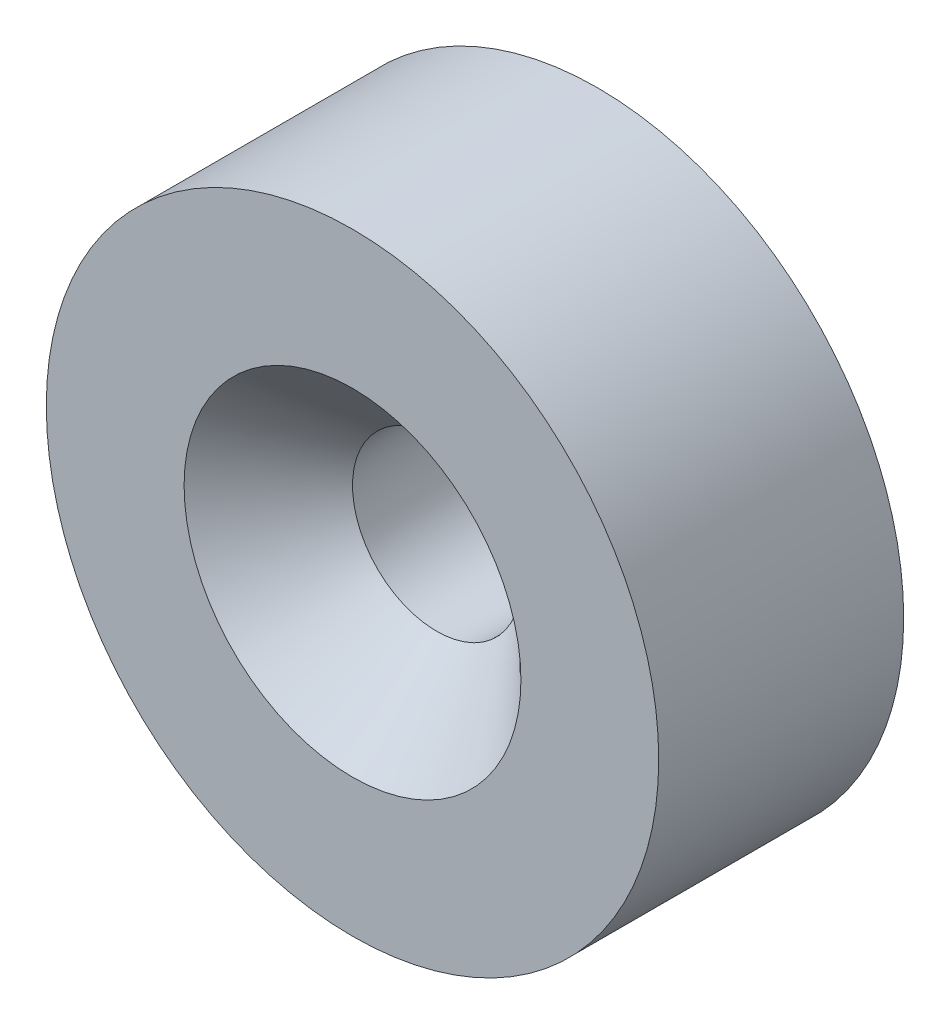
ISO-10303-21;
HEADER;
FILE_DESCRIPTION(('STEP AP214'),'2;1');
FILE_NAME('part.step','',(''),(''),'','','');
FILE_SCHEMA(('AUTOMOTIVE_DESIGN { 1 0 10303 214 1 1 1 1 }'));
ENDSEC;
DATA;
#1=APPLICATION_CONTEXT('core data for automotive mechanical design processes');
#2=APPLICATION_PROTOCOL_DEFINITION('international standard','automotive_design',2000,#1);
#3=PRODUCT_CONTEXT('',#1,'mechanical');
#4=PRODUCT('Part','Part','',(#3));
#5=PRODUCT_RELATED_PRODUCT_CATEGORY('part','',(#4));
#6=PRODUCT_DEFINITION_FORMATION('','',#4);
#7=PRODUCT_DEFINITION_CONTEXT('part definition',#1,'design');
#8=PRODUCT_DEFINITION('design','',#6,#7);
#9=PRODUCT_DEFINITION_SHAPE('','',#8);
#10=(LENGTH_UNIT() NAMED_UNIT(*) SI_UNIT(.MILLI.,.METRE.));
#11=(NAMED_UNIT(*) PLANE_ANGLE_UNIT() SI_UNIT($,.RADIAN.));
#12=(NAMED_UNIT(*) SI_UNIT($,.STERADIAN.) SOLID_ANGLE_UNIT());
#13=UNCERTAINTY_MEASURE_WITH_UNIT(LENGTH_MEASURE(1.E-05),#10,'distance_accuracy_value','');
#14=(GEOMETRIC_REPRESENTATION_CONTEXT(3) GLOBAL_UNCERTAINTY_ASSIGNED_CONTEXT((#13)) GLOBAL_UNIT_ASSIGNED_CONTEXT((#10,
#11,#12)) REPRESENTATION_CONTEXT('',''));
#15=CARTESIAN_POINT('',(0.,0.,0.));
#16=DIRECTION('',(0.,0.,1.));
#17=DIRECTION('',(1.,0.,0.));
#18=AXIS2_PLACEMENT_3D('',#15,#16,#17);
#19=CARTESIAN_POINT('',(0.,0.,8.));
#20=DIRECTION('',(0.,0.,-1.));
#21=DIRECTION('',(-1.,0.,0.));
#22=AXIS2_PLACEMENT_3D('',#19,#20,#21);
#23=CYLINDRICAL_SURFACE('',#22,10.);
#24=CARTESIAN_POINT('',(0.,0.,8.));
#25=DIRECTION('',(0.,0.,1.));
#26=DIRECTION('',(1.,0.,0.));
#27=AXIS2_PLACEMENT_3D('',#24,#25,#26);
#28=CIRCLE('',#27,10.);
#29=CARTESIAN_POINT('',(10.,0.,8.));
#30=VERTEX_POINT('',#29);
#31=EDGE_CURVE('E10',#30,#30,#28,.T.);
#32=ORIENTED_EDGE('',*,*,#31,.F.);
#33=EDGE_LOOP('',(#32));
#34=FACE_BOUND('',#33,.T.);
#35=CARTESIAN_POINT('',(0.,0.,0.));
#36=DIRECTION('',(0.,0.,1.));
#37=DIRECTION('',(1.,0.,0.));
#38=AXIS2_PLACEMENT_3D('',#35,#36,#37);
#39=CIRCLE('',#38,10.);
#40=CARTESIAN_POINT('',(10.,0.,0.));
#41=VERTEX_POINT('',#40);
#42=EDGE_CURVE('E39',#41,#41,#39,.T.);
#43=ORIENTED_EDGE('',*,*,#42,.T.);
#44=EDGE_LOOP('',(#43));
#45=FACE_BOUND('',#44,.T.);
#46=ADVANCED_FACE('F32',(#34,#45),#23,.T.);
#47=CARTESIAN_POINT('',(0.,0.,8.));
#48=DIRECTION('',(0.,0.,1.));
#49=DIRECTION('',(1.,0.,0.));
#50=AXIS2_PLACEMENT_3D('',#47,#48,#49);
#51=PLANE('',#50);
#52=CARTESIAN_POINT('',(0.,0.,8.));
#53=DIRECTION('',(0.,0.,1.));
#54=DIRECTION('',(1.,0.,0.));
#55=AXIS2_PLACEMENT_3D('',#52,#53,#54);
#56=CIRCLE('',#55,5.5);
#57=CARTESIAN_POINT('',(5.5,0.,8.));
#58=VERTEX_POINT('',#57);
#59=EDGE_CURVE('E48',#58,#58,#56,.T.);
#60=ORIENTED_EDGE('',*,*,#59,.F.);
#61=EDGE_LOOP('',(#60));
#62=FACE_BOUND('',#61,.T.);
#63=ORIENTED_EDGE('',*,*,#31,.T.);
#64=EDGE_LOOP('',(#63));
#65=FACE_BOUND('',#64,.T.);
#66=ADVANCED_FACE('F54',(#62,#65),#51,.T.);
#67=CARTESIAN_POINT('',(0.,0.,0.));
#68=DIRECTION('',(0.,0.,1.));
#69=DIRECTION('',(1.,0.,0.));
#70=AXIS2_PLACEMENT_3D('',#67,#68,#69);
#71=PLANE('',#70);
#72=CARTESIAN_POINT('',(0.,0.,0.));
#73=DIRECTION('',(0.,0.,1.));
#74=DIRECTION('',(1.,0.,0.));
#75=AXIS2_PLACEMENT_3D('',#72,#73,#74);
#76=CIRCLE('',#75,2.75);
#77=CARTESIAN_POINT('',(2.75,0.,0.));
#78=VERTEX_POINT('',#77);
#79=EDGE_CURVE('E35',#78,#78,#76,.T.);
#80=ORIENTED_EDGE('',*,*,#79,.T.);
#81=EDGE_LOOP('',(#80));
#82=FACE_BOUND('',#81,.T.);
#83=ORIENTED_EDGE('',*,*,#42,.F.);
#84=EDGE_LOOP('',(#83));
#85=FACE_BOUND('',#84,.T.);
#86=ADVANCED_FACE('F56',(#82,#85),#71,.F.);
#87=CARTESIAN_POINT('',(0.,0.,8.));
#88=DIRECTION('',(0.,0.,1.));
#89=DIRECTION('',(1.,0.,0.));
#90=AXIS2_PLACEMENT_3D('',#87,#88,#89);
#91=CYLINDRICAL_SURFACE('',#90,2.75);
#92=CARTESIAN_POINT('',(0.,0.,5.25));
#93=DIRECTION('',(0.,0.,1.));
#94=DIRECTION('',(1.,0.,0.));
#95=AXIS2_PLACEMENT_3D('',#92,#93,#94);
#96=CIRCLE('',#95,2.75);
#97=CARTESIAN_POINT('',(2.75,0.,5.25));
#98=VERTEX_POINT('',#97);
#99=EDGE_CURVE('E45',#98,#98,#96,.T.);
#100=ORIENTED_EDGE('',*,*,#99,.T.);
#101=EDGE_LOOP('',(#100));
#102=FACE_BOUND('',#101,.T.);
#103=ORIENTED_EDGE('',*,*,#79,.F.);
#104=EDGE_LOOP('',(#103));
#105=FACE_BOUND('',#104,.T.);
#106=ADVANCED_FACE('F62',(#102,#105),#91,.F.);
#107=CARTESIAN_POINT('',(0.,0.,8.));
#108=DIRECTION('',(0.,0.,1.));
#109=DIRECTION('',(1.,0.,0.));
#110=AXIS2_PLACEMENT_3D('',#107,#108,#109);
#111=CONICAL_SURFACE('',#110,5.5,0.785398163397448);
#112=ORIENTED_EDGE('',*,*,#99,.F.);
#113=EDGE_LOOP('',(#112));
#114=FACE_BOUND('',#113,.T.);
#115=ORIENTED_EDGE('',*,*,#59,.T.);
#116=EDGE_LOOP('',(#115));
#117=FACE_BOUND('',#116,.T.);
#118=ADVANCED_FACE('F52',(#114,#117),#111,.F.);
#119=CLOSED_SHELL('',(#46,#66,#86,#106,#118));
#120=MANIFOLD_SOLID_BREP('B2',#119);
#121=ADVANCED_BREP_SHAPE_REPRESENTATION('',(#18,#120),#14);
#122=SHAPE_DEFINITION_REPRESENTATION(#9,#121);
ENDSEC;
END-ISO-10303-21;
